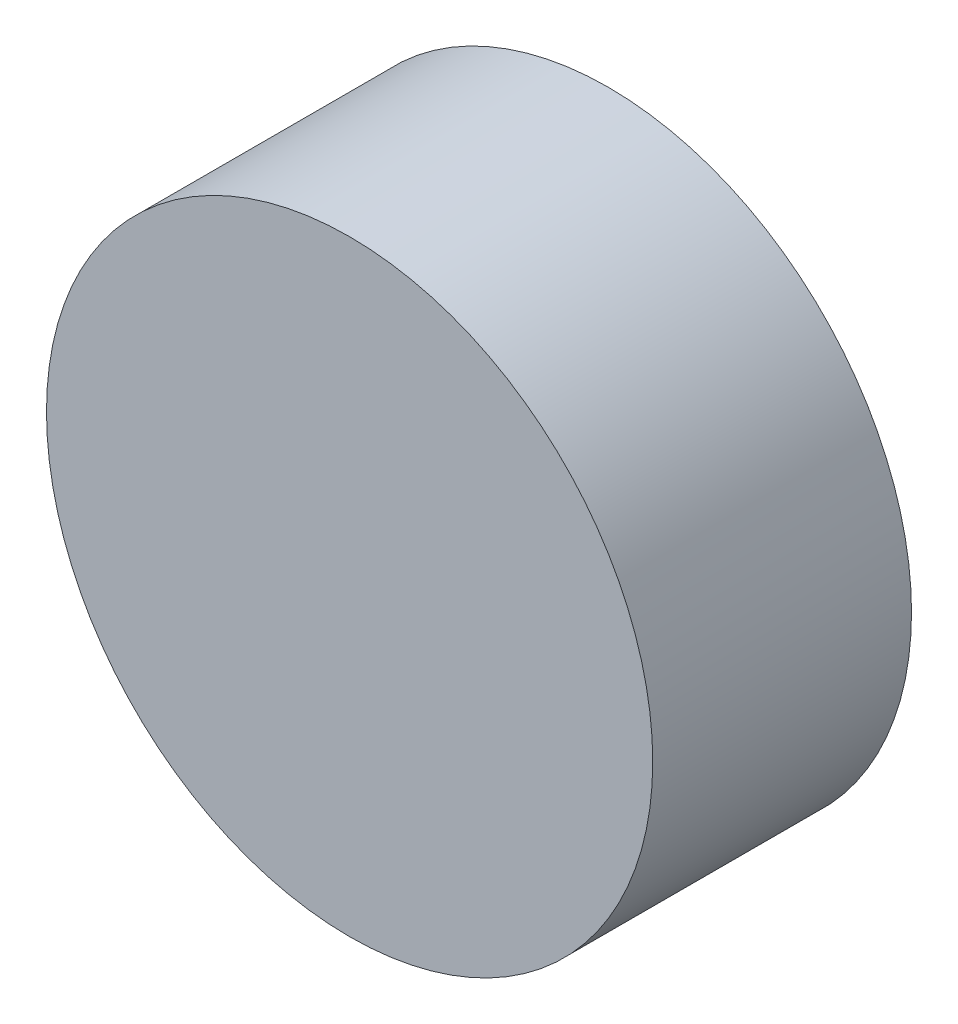
ISO-10303-21;
HEADER;
FILE_DESCRIPTION(('STEP AP214'),'2;1');
FILE_NAME('part.step','',(''),(''),'','','');
FILE_SCHEMA(('AUTOMOTIVE_DESIGN { 1 0 10303 214 1 1 1 1 }'));
ENDSEC;
DATA;
#1=APPLICATION_CONTEXT('core data for automotive mechanical design processes');
#2=APPLICATION_PROTOCOL_DEFINITION('international standard','automotive_design',2000,#1);
#3=PRODUCT_CONTEXT('',#1,'mechanical');
#4=PRODUCT('Part','Part','',(#3));
#5=PRODUCT_RELATED_PRODUCT_CATEGORY('part','',(#4));
#6=PRODUCT_DEFINITION_FORMATION('','',#4);
#7=PRODUCT_DEFINITION_CONTEXT('part definition',#1,'design');
#8=PRODUCT_DEFINITION('design','',#6,#7);
#9=PRODUCT_DEFINITION_SHAPE('','',#8);
#10=(LENGTH_UNIT() NAMED_UNIT(*) SI_UNIT(.MILLI.,.METRE.));
#11=(NAMED_UNIT(*) PLANE_ANGLE_UNIT() SI_UNIT($,.RADIAN.));
#12=(NAMED_UNIT(*) SI_UNIT($,.STERADIAN.) SOLID_ANGLE_UNIT());
#13=UNCERTAINTY_MEASURE_WITH_UNIT(LENGTH_MEASURE(1.E-05),#10,'distance_accuracy_value','');
#14=(GEOMETRIC_REPRESENTATION_CONTEXT(3) GLOBAL_UNCERTAINTY_ASSIGNED_CONTEXT((#13)) GLOBAL_UNIT_ASSIGNED_CONTEXT((#10,
#11,#12)) REPRESENTATION_CONTEXT('',''));
#15=CARTESIAN_POINT('',(0.,0.,0.));
#16=DIRECTION('',(0.,0.,1.));
#17=DIRECTION('',(1.,0.,0.));
#18=AXIS2_PLACEMENT_3D('',#15,#16,#17);
#19=CARTESIAN_POINT('',(0.,0.,28.));
#20=DIRECTION('',(0.,0.,-1.));
#21=DIRECTION('',(-1.,0.,0.));
#22=AXIS2_PLACEMENT_3D('',#19,#20,#21);
#23=CYLINDRICAL_SURFACE('',#22,32.8);
#24=CARTESIAN_POINT('',(0.,0.,28.));
#25=DIRECTION('',(0.,0.,1.));
#26=DIRECTION('',(1.,0.,0.));
#27=AXIS2_PLACEMENT_3D('',#24,#25,#26);
#28=CIRCLE('',#27,32.8);
#29=CARTESIAN_POINT('',(32.8,0.,28.));
#30=VERTEX_POINT('',#29);
#31=EDGE_CURVE('E10',#30,#30,#28,.T.);
#32=ORIENTED_EDGE('',*,*,#31,.F.);
#33=EDGE_LOOP('',(#32));
#34=FACE_BOUND('',#33,.T.);
#35=CARTESIAN_POINT('',(0.,0.,0.));
#36=DIRECTION('',(0.,0.,1.));
#37=DIRECTION('',(1.,0.,0.));
#38=AXIS2_PLACEMENT_3D('',#35,#36,#37);
#39=CIRCLE('',#38,32.8);
#40=CARTESIAN_POINT('',(32.8,0.,0.));
#41=VERTEX_POINT('',#40);
#42=EDGE_CURVE('E46',#41,#41,#39,.T.);
#43=ORIENTED_EDGE('',*,*,#42,.T.);
#44=EDGE_LOOP('',(#43));
#45=FACE_BOUND('',#44,.T.);
#46=ADVANCED_FACE('F43',(#34,#45),#23,.T.);
#47=CARTESIAN_POINT('',(0.,0.,28.));
#48=DIRECTION('',(0.,0.,1.));
#49=DIRECTION('',(1.,0.,0.));
#50=AXIS2_PLACEMENT_3D('',#47,#48,#49);
#51=PLANE('',#50);
#52=ORIENTED_EDGE('',*,*,#31,.T.);
#53=EDGE_LOOP('',(#52));
#54=FACE_BOUND('',#53,.T.);
#55=ADVANCED_FACE('F58',(#54),#51,.T.);
#56=CARTESIAN_POINT('',(0.,0.,0.));
#57=DIRECTION('',(0.,0.,1.));
#58=DIRECTION('',(1.,0.,0.));
#59=AXIS2_PLACEMENT_3D('',#56,#57,#58);
#60=PLANE('',#59);
#61=ORIENTED_EDGE('',*,*,#42,.F.);
#62=EDGE_LOOP('',(#61));
#63=FACE_BOUND('',#62,.T.);
#64=ADVANCED_FACE('F59',(#63),#60,.F.);
#65=CLOSED_SHELL('',(#46,#55,#64));
#66=MANIFOLD_SOLID_BREP('B2',#65);
#67=ADVANCED_BREP_SHAPE_REPRESENTATION('',(#18,#66),#14);
#68=SHAPE_DEFINITION_REPRESENTATION(#9,#67);
ENDSEC;
END-ISO-10303-21;
